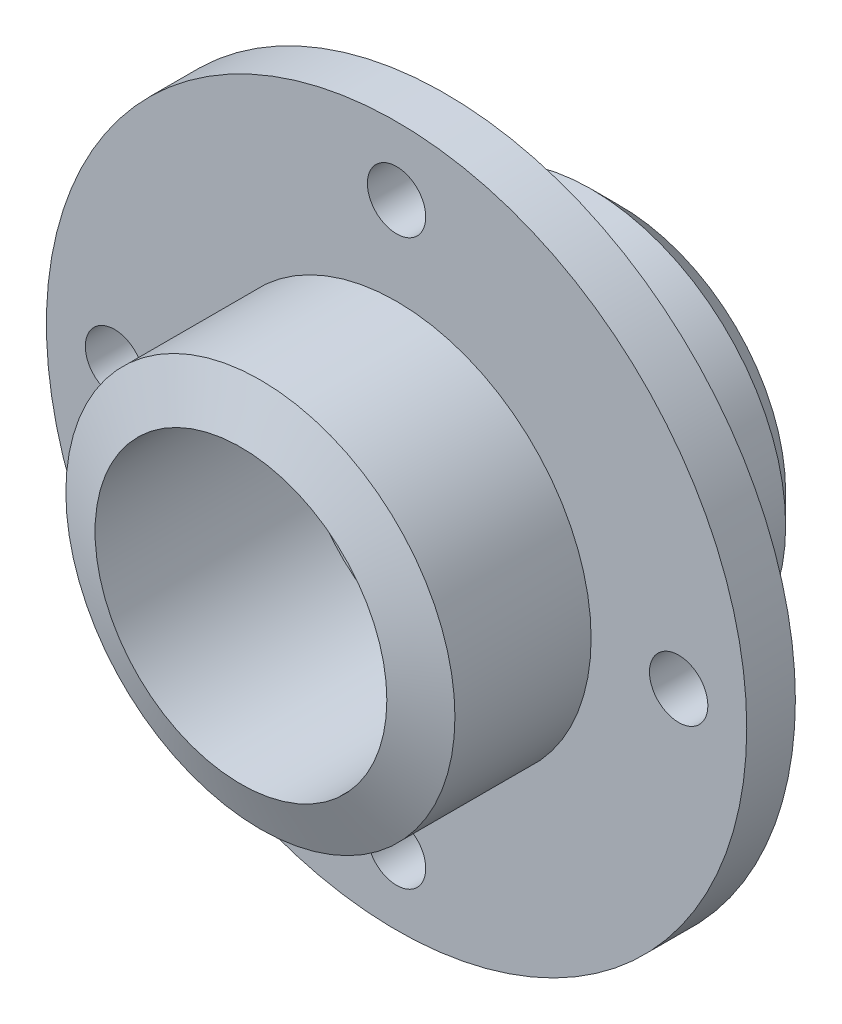
ISO-10303-21;
HEADER;
FILE_DESCRIPTION(('STEP AP214'),'2;1');
FILE_NAME('part.step','',(''),(''),'','','');
FILE_SCHEMA(('AUTOMOTIVE_DESIGN { 1 0 10303 214 1 1 1 1 }'));
ENDSEC;
DATA;
#1=APPLICATION_CONTEXT('core data for automotive mechanical design processes');
#2=APPLICATION_PROTOCOL_DEFINITION('international standard','automotive_design',2000,#1);
#3=PRODUCT_CONTEXT('',#1,'mechanical');
#4=PRODUCT('Part','Part','',(#3));
#5=PRODUCT_RELATED_PRODUCT_CATEGORY('part','',(#4));
#6=PRODUCT_DEFINITION_FORMATION('','',#4);
#7=PRODUCT_DEFINITION_CONTEXT('part definition',#1,'design');
#8=PRODUCT_DEFINITION('design','',#6,#7);
#9=PRODUCT_DEFINITION_SHAPE('','',#8);
#10=(LENGTH_UNIT() NAMED_UNIT(*) SI_UNIT(.MILLI.,.METRE.));
#11=(NAMED_UNIT(*) PLANE_ANGLE_UNIT() SI_UNIT($,.RADIAN.));
#12=(NAMED_UNIT(*) SI_UNIT($,.STERADIAN.) SOLID_ANGLE_UNIT());
#13=UNCERTAINTY_MEASURE_WITH_UNIT(LENGTH_MEASURE(1.E-05),#10,'distance_accuracy_value','');
#14=(GEOMETRIC_REPRESENTATION_CONTEXT(3) GLOBAL_UNCERTAINTY_ASSIGNED_CONTEXT((#13)) GLOBAL_UNIT_ASSIGNED_CONTEXT((#10,
#11,#12)) REPRESENTATION_CONTEXT('',''));
#15=CARTESIAN_POINT('',(0.,0.,0.));
#16=DIRECTION('',(0.,0.,1.));
#17=DIRECTION('',(1.,0.,0.));
#18=AXIS2_PLACEMENT_3D('',#15,#16,#17);
#19=CARTESIAN_POINT('',(34.,0.,-78.));
#20=DIRECTION('',(0.,0.,-1.));
#21=DIRECTION('',(-1.,0.,0.));
#22=AXIS2_PLACEMENT_3D('',#19,#20,#21);
#23=PLANE('',#22);
#24=CARTESIAN_POINT('',(0.,0.,-78.));
#25=DIRECTION('',(0.,0.,1.));
#26=DIRECTION('',(1.,0.,0.));
#27=AXIS2_PLACEMENT_3D('',#24,#25,#26);
#28=CIRCLE('',#27,24.);
#29=CARTESIAN_POINT('',(24.,0.,-78.));
#30=VERTEX_POINT('',#29);
#31=EDGE_CURVE('E10',#30,#30,#28,.T.);
#32=ORIENTED_EDGE('',*,*,#31,.T.);
#33=EDGE_LOOP('',(#32));
#34=FACE_BOUND('',#33,.T.);
#35=CARTESIAN_POINT('',(0.,0.,-78.));
#36=DIRECTION('',(0.,0.,1.));
#37=DIRECTION('',(1.,0.,0.));
#38=AXIS2_PLACEMENT_3D('',#35,#36,#37);
#39=CIRCLE('',#38,34.);
#40=CARTESIAN_POINT('',(34.,0.,-78.));
#41=VERTEX_POINT('',#40);
#42=EDGE_CURVE('E78',#41,#41,#39,.T.);
#43=ORIENTED_EDGE('',*,*,#42,.F.);
#44=EDGE_LOOP('',(#43));
#45=FACE_BOUND('',#44,.T.);
#46=ADVANCED_FACE('F35',(#34,#45),#23,.T.);
#47=CARTESIAN_POINT('',(0.,0.,0.));
#48=DIRECTION('',(0.,0.,1.));
#49=DIRECTION('',(1.,0.,0.));
#50=AXIS2_PLACEMENT_3D('',#47,#48,#49);
#51=CYLINDRICAL_SURFACE('',#50,24.);
#52=CARTESIAN_POINT('',(0.,0.,-72.));
#53=DIRECTION('',(0.,0.,1.));
#54=DIRECTION('',(1.,0.,0.));
#55=AXIS2_PLACEMENT_3D('',#52,#53,#54);
#56=CIRCLE('',#55,24.);
#57=CARTESIAN_POINT('',(24.,0.,-72.));
#58=VERTEX_POINT('',#57);
#59=EDGE_CURVE('E41',#58,#58,#56,.T.);
#60=ORIENTED_EDGE('',*,*,#59,.T.);
#61=EDGE_LOOP('',(#60));
#62=FACE_BOUND('',#61,.T.);
#63=ORIENTED_EDGE('',*,*,#31,.F.);
#64=EDGE_LOOP('',(#63));
#65=FACE_BOUND('',#64,.T.);
#66=ADVANCED_FACE('F169',(#62,#65),#51,.F.);
#67=CARTESIAN_POINT('',(24.,0.,-72.));
#68=DIRECTION('',(0.,0.,1.));
#69=DIRECTION('',(1.,0.,0.));
#70=AXIS2_PLACEMENT_3D('',#67,#68,#69);
#71=PLANE('',#70);
#72=CARTESIAN_POINT('',(0.,0.,-72.));
#73=DIRECTION('',(0.,0.,1.));
#74=DIRECTION('',(1.,0.,0.));
#75=AXIS2_PLACEMENT_3D('',#72,#73,#74);
#76=CIRCLE('',#75,34.);
#77=CARTESIAN_POINT('',(34.,0.,-72.));
#78=VERTEX_POINT('',#77);
#79=EDGE_CURVE('E45',#78,#78,#76,.T.);
#80=ORIENTED_EDGE('',*,*,#79,.T.);
#81=EDGE_LOOP('',(#80));
#82=FACE_BOUND('',#81,.T.);
#83=ORIENTED_EDGE('',*,*,#59,.F.);
#84=EDGE_LOOP('',(#83));
#85=FACE_BOUND('',#84,.T.);
#86=ADVANCED_FACE('F163',(#82,#85),#71,.T.);
#87=CARTESIAN_POINT('',(0.,0.,0.));
#88=DIRECTION('',(0.,0.,1.));
#89=DIRECTION('',(1.,0.,0.));
#90=AXIS2_PLACEMENT_3D('',#87,#88,#89);
#91=CYLINDRICAL_SURFACE('',#90,34.);
#92=CARTESIAN_POINT('',(0.,0.,-42.));
#93=DIRECTION('',(0.,0.,1.));
#94=DIRECTION('',(1.,0.,0.));
#95=AXIS2_PLACEMENT_3D('',#92,#93,#94);
#96=CIRCLE('',#95,34.);
#97=CARTESIAN_POINT('',(34.,0.,-42.));
#98=VERTEX_POINT('',#97);
#99=EDGE_CURVE('E49',#98,#98,#96,.T.);
#100=ORIENTED_EDGE('',*,*,#99,.T.);
#101=EDGE_LOOP('',(#100));
#102=FACE_BOUND('',#101,.T.);
#103=ORIENTED_EDGE('',*,*,#79,.F.);
#104=EDGE_LOOP('',(#103));
#105=FACE_BOUND('',#104,.T.);
#106=ADVANCED_FACE('F157',(#102,#105),#91,.F.);
#107=CARTESIAN_POINT('',(34.,0.,-42.));
#108=DIRECTION('',(0.,0.,-1.));
#109=DIRECTION('',(-1.,0.,0.));
#110=AXIS2_PLACEMENT_3D('',#107,#108,#109);
#111=PLANE('',#110);
#112=CARTESIAN_POINT('',(0.,0.,-42.));
#113=DIRECTION('',(0.,0.,1.));
#114=DIRECTION('',(1.,0.,0.));
#115=AXIS2_PLACEMENT_3D('',#112,#113,#114);
#116=CIRCLE('',#115,30.);
#117=CARTESIAN_POINT('',(30.,0.,-42.));
#118=VERTEX_POINT('',#117);
#119=EDGE_CURVE('E54',#118,#118,#116,.T.);
#120=ORIENTED_EDGE('',*,*,#119,.T.);
#121=EDGE_LOOP('',(#120));
#122=FACE_BOUND('',#121,.T.);
#123=ORIENTED_EDGE('',*,*,#99,.F.);
#124=EDGE_LOOP('',(#123));
#125=FACE_BOUND('',#124,.T.);
#126=ADVANCED_FACE('F151',(#122,#125),#111,.T.);
#127=CARTESIAN_POINT('',(0.,0.,0.));
#128=DIRECTION('',(0.,0.,1.));
#129=DIRECTION('',(1.,0.,0.));
#130=AXIS2_PLACEMENT_3D('',#127,#128,#129);
#131=CYLINDRICAL_SURFACE('',#130,30.);
#132=CARTESIAN_POINT('',(0.,0.,0.));
#133=DIRECTION('',(0.,0.,1.));
#134=DIRECTION('',(1.,0.,0.));
#135=AXIS2_PLACEMENT_3D('',#132,#133,#134);
#136=CIRCLE('',#135,30.);
#137=CARTESIAN_POINT('',(30.,0.,0.));
#138=VERTEX_POINT('',#137);
#139=EDGE_CURVE('E57',#138,#138,#136,.T.);
#140=ORIENTED_EDGE('',*,*,#139,.T.);
#141=EDGE_LOOP('',(#140));
#142=FACE_BOUND('',#141,.T.);
#143=ORIENTED_EDGE('',*,*,#119,.F.);
#144=EDGE_LOOP('',(#143));
#145=FACE_BOUND('',#144,.T.);
#146=ADVANCED_FACE('F145',(#142,#145),#131,.F.);
#147=CARTESIAN_POINT('',(0.,0.,0.));
#148=DIRECTION('',(0.,0.,-1.));
#149=DIRECTION('',(-1.,0.,0.));
#150=AXIS2_PLACEMENT_3D('',#147,#148,#149);
#151=CONICAL_SURFACE('',#150,30.,1.19028994968253);
#152=CARTESIAN_POINT('',(0.,0.,-4.));
#153=DIRECTION('',(0.,0.,1.));
#154=DIRECTION('',(1.,0.,0.));
#155=AXIS2_PLACEMENT_3D('',#152,#153,#154);
#156=CIRCLE('',#155,40.);
#157=CARTESIAN_POINT('',(40.,0.,-4.));
#158=VERTEX_POINT('',#157);
#159=EDGE_CURVE('E60',#158,#158,#156,.T.);
#160=ORIENTED_EDGE('',*,*,#159,.T.);
#161=EDGE_LOOP('',(#160));
#162=FACE_BOUND('',#161,.T.);
#163=ORIENTED_EDGE('',*,*,#139,.F.);
#164=EDGE_LOOP('',(#163));
#165=FACE_BOUND('',#164,.T.);
#166=ADVANCED_FACE('F139',(#162,#165),#151,.T.);
#167=CARTESIAN_POINT('',(0.,0.,0.));
#168=DIRECTION('',(0.,0.,1.));
#169=DIRECTION('',(1.,0.,0.));
#170=AXIS2_PLACEMENT_3D('',#167,#168,#169);
#171=CYLINDRICAL_SURFACE('',#170,40.);
#172=CARTESIAN_POINT('',(0.,0.,-32.));
#173=DIRECTION('',(0.,0.,1.));
#174=DIRECTION('',(1.,0.,0.));
#175=AXIS2_PLACEMENT_3D('',#172,#173,#174);
#176=CIRCLE('',#175,40.);
#177=CARTESIAN_POINT('',(40.,0.,-32.));
#178=VERTEX_POINT('',#177);
#179=EDGE_CURVE('E63',#178,#178,#176,.T.);
#180=ORIENTED_EDGE('',*,*,#179,.T.);
#181=EDGE_LOOP('',(#180));
#182=FACE_BOUND('',#181,.T.);
#183=ORIENTED_EDGE('',*,*,#159,.F.);
#184=EDGE_LOOP('',(#183));
#185=FACE_BOUND('',#184,.T.);
#186=ADVANCED_FACE('F132',(#182,#185),#171,.T.);
#187=CARTESIAN_POINT('',(40.,0.,-32.));
#188=DIRECTION('',(0.,0.,1.));
#189=DIRECTION('',(1.,0.,0.));
#190=AXIS2_PLACEMENT_3D('',#187,#188,#189);
#191=PLANE('',#190);
#192=CARTESIAN_POINT('',(0.,58.,-32.));
#193=DIRECTION('',(0.,0.,1.));
#194=DIRECTION('',(1.,0.,0.));
#195=AXIS2_PLACEMENT_3D('',#192,#193,#194);
#196=CIRCLE('',#195,6.);
#197=CARTESIAN_POINT('',(6.,58.,-32.));
#198=VERTEX_POINT('',#197);
#199=EDGE_CURVE('E81',#198,#198,#196,.T.);
#200=ORIENTED_EDGE('',*,*,#199,.F.);
#201=EDGE_LOOP('',(#200));
#202=FACE_BOUND('',#201,.T.);
#203=CARTESIAN_POINT('',(-58.,0.,-32.));
#204=DIRECTION('',(0.,0.,1.));
#205=DIRECTION('',(1.,0.,0.));
#206=AXIS2_PLACEMENT_3D('',#203,#204,#205);
#207=CIRCLE('',#206,6.0000000000002);
#208=CARTESIAN_POINT('',(-51.9999999999998,0.,-32.));
#209=VERTEX_POINT('',#208);
#210=EDGE_CURVE('E84',#209,#209,#207,.T.);
#211=ORIENTED_EDGE('',*,*,#210,.F.);
#212=EDGE_LOOP('',(#211));
#213=FACE_BOUND('',#212,.T.);
#214=CARTESIAN_POINT('',(0.,-58.,-32.));
#215=DIRECTION('',(0.,0.,1.));
#216=DIRECTION('',(1.,0.,0.));
#217=AXIS2_PLACEMENT_3D('',#214,#215,#216);
#218=CIRCLE('',#217,6.00000000000039);
#219=CARTESIAN_POINT('',(6.00000000000039,-58.,-32.));
#220=VERTEX_POINT('',#219);
#221=EDGE_CURVE('E87',#220,#220,#218,.T.);
#222=ORIENTED_EDGE('',*,*,#221,.F.);
#223=EDGE_LOOP('',(#222));
#224=FACE_BOUND('',#223,.T.);
#225=CARTESIAN_POINT('',(58.,0.,-32.));
#226=DIRECTION('',(0.,0.,1.));
#227=DIRECTION('',(1.,0.,0.));
#228=AXIS2_PLACEMENT_3D('',#225,#226,#227);
#229=CIRCLE('',#228,6.00000000000059);
#230=CARTESIAN_POINT('',(64.0000000000006,0.,-32.));
#231=VERTEX_POINT('',#230);
#232=EDGE_CURVE('E90',#231,#231,#229,.T.);
#233=ORIENTED_EDGE('',*,*,#232,.F.);
#234=EDGE_LOOP('',(#233));
#235=FACE_BOUND('',#234,.T.);
#236=CARTESIAN_POINT('',(0.,0.,-32.));
#237=DIRECTION('',(0.,0.,1.));
#238=DIRECTION('',(1.,0.,0.));
#239=AXIS2_PLACEMENT_3D('',#236,#237,#238);
#240=CIRCLE('',#239,72.);
#241=CARTESIAN_POINT('',(72.,0.,-32.));
#242=VERTEX_POINT('',#241);
#243=EDGE_CURVE('E66',#242,#242,#240,.T.);
#244=ORIENTED_EDGE('',*,*,#243,.T.);
#245=EDGE_LOOP('',(#244));
#246=FACE_BOUND('',#245,.T.);
#247=ORIENTED_EDGE('',*,*,#179,.F.);
#248=EDGE_LOOP('',(#247));
#249=FACE_BOUND('',#248,.T.);
#250=ADVANCED_FACE('F126',(#202,#213,#224,#235,#246,#249),#191,.T.);
#251=CARTESIAN_POINT('',(0.,0.,0.));
#252=DIRECTION('',(0.,0.,1.));
#253=DIRECTION('',(1.,0.,0.));
#254=AXIS2_PLACEMENT_3D('',#251,#252,#253);
#255=CYLINDRICAL_SURFACE('',#254,72.);
#256=CARTESIAN_POINT('',(0.,0.,-42.));
#257=DIRECTION('',(0.,0.,1.));
#258=DIRECTION('',(1.,0.,0.));
#259=AXIS2_PLACEMENT_3D('',#256,#257,#258);
#260=CIRCLE('',#259,72.);
#261=CARTESIAN_POINT('',(72.,0.,-42.));
#262=VERTEX_POINT('',#261);
#263=EDGE_CURVE('E69',#262,#262,#260,.T.);
#264=ORIENTED_EDGE('',*,*,#263,.T.);
#265=EDGE_LOOP('',(#264));
#266=FACE_BOUND('',#265,.T.);
#267=ORIENTED_EDGE('',*,*,#243,.F.);
#268=EDGE_LOOP('',(#267));
#269=FACE_BOUND('',#268,.T.);
#270=ADVANCED_FACE('F112',(#266,#269),#255,.T.);
#271=CARTESIAN_POINT('',(72.,0.,-42.));
#272=DIRECTION('',(0.,0.,-1.));
#273=DIRECTION('',(-1.,0.,0.));
#274=AXIS2_PLACEMENT_3D('',#271,#272,#273);
#275=PLANE('',#274);
#276=CARTESIAN_POINT('',(0.,58.,-42.));
#277=DIRECTION('',(0.,0.,-1.));
#278=DIRECTION('',(-1.,0.,0.));
#279=AXIS2_PLACEMENT_3D('',#276,#277,#278);
#280=CIRCLE('',#279,6.);
#281=CARTESIAN_POINT('',(-6.,58.,-42.));
#282=VERTEX_POINT('',#281);
#283=EDGE_CURVE('E93',#282,#282,#280,.T.);
#284=ORIENTED_EDGE('',*,*,#283,.F.);
#285=EDGE_LOOP('',(#284));
#286=FACE_BOUND('',#285,.T.);
#287=CARTESIAN_POINT('',(-58.,0.,-42.));
#288=DIRECTION('',(0.,0.,-1.));
#289=DIRECTION('',(-1.,0.,0.));
#290=AXIS2_PLACEMENT_3D('',#287,#288,#289);
#291=CIRCLE('',#290,6.0000000000002);
#292=CARTESIAN_POINT('',(-64.0000000000002,0.,-42.));
#293=VERTEX_POINT('',#292);
#294=EDGE_CURVE('E100',#293,#293,#291,.T.);
#295=ORIENTED_EDGE('',*,*,#294,.F.);
#296=EDGE_LOOP('',(#295));
#297=FACE_BOUND('',#296,.T.);
#298=CARTESIAN_POINT('',(0.,-58.,-42.));
#299=DIRECTION('',(0.,0.,-1.));
#300=DIRECTION('',(-1.,0.,0.));
#301=AXIS2_PLACEMENT_3D('',#298,#299,#300);
#302=CIRCLE('',#301,6.00000000000039);
#303=CARTESIAN_POINT('',(-6.0000000000004,-58.,-42.));
#304=VERTEX_POINT('',#303);
#305=EDGE_CURVE('E97',#304,#304,#302,.T.);
#306=ORIENTED_EDGE('',*,*,#305,.F.);
#307=EDGE_LOOP('',(#306));
#308=FACE_BOUND('',#307,.T.);
#309=CARTESIAN_POINT('',(58.,0.,-42.));
#310=DIRECTION('',(0.,0.,-1.));
#311=DIRECTION('',(-1.,0.,0.));
#312=AXIS2_PLACEMENT_3D('',#309,#310,#311);
#313=CIRCLE('',#312,6.00000000000059);
#314=CARTESIAN_POINT('',(51.9999999999994,0.,-42.));
#315=VERTEX_POINT('',#314);
#316=EDGE_CURVE('E94',#315,#315,#313,.T.);
#317=ORIENTED_EDGE('',*,*,#316,.F.);
#318=EDGE_LOOP('',(#317));
#319=FACE_BOUND('',#318,.T.);
#320=CARTESIAN_POINT('',(0.,0.,-42.));
#321=DIRECTION('',(0.,0.,1.));
#322=DIRECTION('',(1.,0.,0.));
#323=AXIS2_PLACEMENT_3D('',#320,#321,#322);
#324=CIRCLE('',#323,40.);
#325=CARTESIAN_POINT('',(40.,0.,-42.));
#326=VERTEX_POINT('',#325);
#327=EDGE_CURVE('E72',#326,#326,#324,.T.);
#328=ORIENTED_EDGE('',*,*,#327,.T.);
#329=EDGE_LOOP('',(#328));
#330=FACE_BOUND('',#329,.T.);
#331=ORIENTED_EDGE('',*,*,#263,.F.);
#332=EDGE_LOOP('',(#331));
#333=FACE_BOUND('',#332,.T.);
#334=ADVANCED_FACE('F108',(#286,#297,#308,#319,#330,#333),#275,.T.);
#335=CARTESIAN_POINT('',(0.,0.,0.));
#336=DIRECTION('',(0.,0.,1.));
#337=DIRECTION('',(1.,0.,0.));
#338=AXIS2_PLACEMENT_3D('',#335,#336,#337);
#339=CYLINDRICAL_SURFACE('',#338,40.);
#340=CARTESIAN_POINT('',(0.,0.,-72.));
#341=DIRECTION('',(0.,0.,1.));
#342=DIRECTION('',(1.,0.,0.));
#343=AXIS2_PLACEMENT_3D('',#340,#341,#342);
#344=CIRCLE('',#343,40.);
#345=CARTESIAN_POINT('',(40.,0.,-72.));
#346=VERTEX_POINT('',#345);
#347=EDGE_CURVE('E75',#346,#346,#344,.T.);
#348=ORIENTED_EDGE('',*,*,#347,.T.);
#349=EDGE_LOOP('',(#348));
#350=FACE_BOUND('',#349,.T.);
#351=ORIENTED_EDGE('',*,*,#327,.F.);
#352=EDGE_LOOP('',(#351));
#353=FACE_BOUND('',#352,.T.);
#354=ADVANCED_FACE('F111',(#350,#353),#339,.T.);
#355=CARTESIAN_POINT('',(0.,0.,-72.));
#356=DIRECTION('',(0.,0.,1.));
#357=DIRECTION('',(1.,0.,0.));
#358=AXIS2_PLACEMENT_3D('',#355,#356,#357);
#359=CONICAL_SURFACE('',#358,40.,0.785398163397448);
#360=ORIENTED_EDGE('',*,*,#42,.T.);
#361=EDGE_LOOP('',(#360));
#362=FACE_BOUND('',#361,.T.);
#363=ORIENTED_EDGE('',*,*,#347,.F.);
#364=EDGE_LOOP('',(#363));
#365=FACE_BOUND('',#364,.T.);
#366=ADVANCED_FACE('F180',(#362,#365),#359,.T.);
#367=CARTESIAN_POINT('',(58.,0.,0.));
#368=DIRECTION('',(0.,0.,-1.));
#369=DIRECTION('',(-1.,0.,0.));
#370=AXIS2_PLACEMENT_3D('',#367,#368,#369);
#371=CYLINDRICAL_SURFACE('',#370,6.00000000000059);
#372=ORIENTED_EDGE('',*,*,#232,.T.);
#373=EDGE_LOOP('',(#372));
#374=FACE_BOUND('',#373,.T.);
#375=ORIENTED_EDGE('',*,*,#316,.T.);
#376=EDGE_LOOP('',(#375));
#377=FACE_BOUND('',#376,.T.);
#378=ADVANCED_FACE('F183',(#374,#377),#371,.F.);
#379=CARTESIAN_POINT('',(0.,-58.,0.));
#380=DIRECTION('',(0.,0.,-1.));
#381=DIRECTION('',(-1.,0.,0.));
#382=AXIS2_PLACEMENT_3D('',#379,#380,#381);
#383=CYLINDRICAL_SURFACE('',#382,6.00000000000039);
#384=ORIENTED_EDGE('',*,*,#221,.T.);
#385=EDGE_LOOP('',(#384));
#386=FACE_BOUND('',#385,.T.);
#387=ORIENTED_EDGE('',*,*,#305,.T.);
#388=EDGE_LOOP('',(#387));
#389=FACE_BOUND('',#388,.T.);
#390=ADVANCED_FACE('F196',(#386,#389),#383,.F.);
#391=CARTESIAN_POINT('',(-58.,0.,0.));
#392=DIRECTION('',(0.,0.,-1.));
#393=DIRECTION('',(-1.,0.,0.));
#394=AXIS2_PLACEMENT_3D('',#391,#392,#393);
#395=CYLINDRICAL_SURFACE('',#394,6.0000000000002);
#396=ORIENTED_EDGE('',*,*,#210,.T.);
#397=EDGE_LOOP('',(#396));
#398=FACE_BOUND('',#397,.T.);
#399=ORIENTED_EDGE('',*,*,#294,.T.);
#400=EDGE_LOOP('',(#399));
#401=FACE_BOUND('',#400,.T.);
#402=ADVANCED_FACE('F200',(#398,#401),#395,.F.);
#403=CARTESIAN_POINT('',(0.,58.,0.));
#404=DIRECTION('',(0.,0.,-1.));
#405=DIRECTION('',(-1.,0.,0.));
#406=AXIS2_PLACEMENT_3D('',#403,#404,#405);
#407=CYLINDRICAL_SURFACE('',#406,6.);
#408=ORIENTED_EDGE('',*,*,#199,.T.);
#409=EDGE_LOOP('',(#408));
#410=FACE_BOUND('',#409,.T.);
#411=ORIENTED_EDGE('',*,*,#283,.T.);
#412=EDGE_LOOP('',(#411));
#413=FACE_BOUND('',#412,.T.);
#414=ADVANCED_FACE('F106',(#410,#413),#407,.F.);
#415=CLOSED_SHELL('',(#46,#66,#86,#106,#126,#146,#166,#186,#250,#270,#334,#354,#366,#378,#390,
#402,#414));
#416=MANIFOLD_SOLID_BREP('B2',#415);
#417=ADVANCED_BREP_SHAPE_REPRESENTATION('',(#18,#416),#14);
#418=SHAPE_DEFINITION_REPRESENTATION(#9,#417);
ENDSEC;
END-ISO-10303-21;
